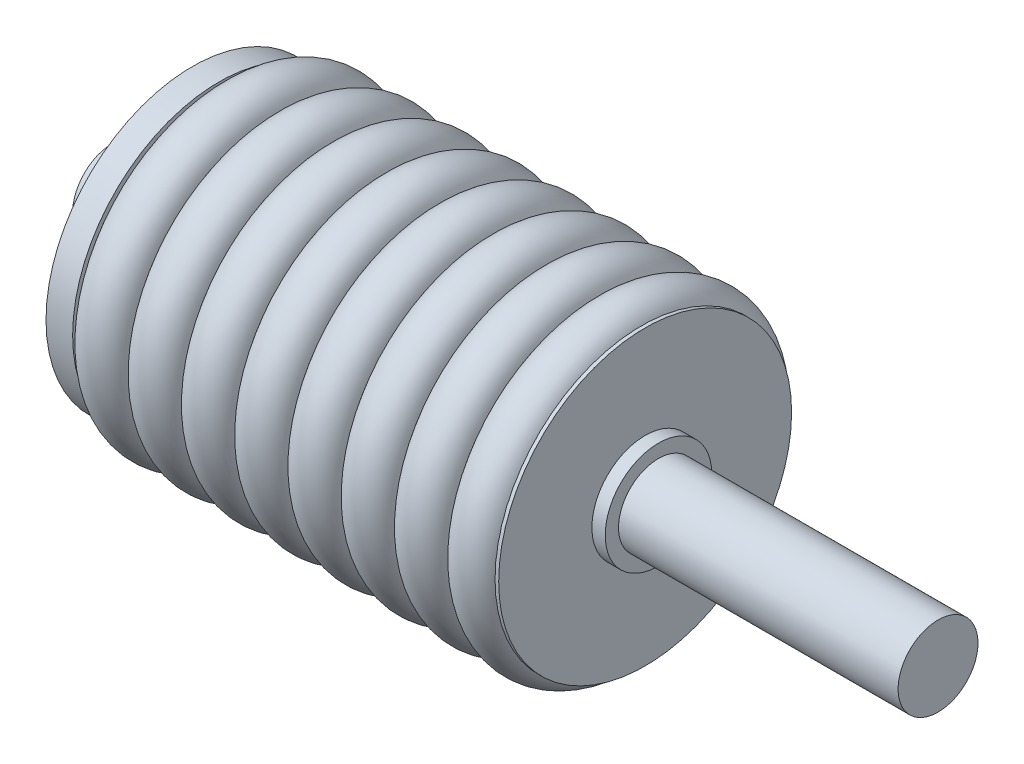
ISO-10303-21;
HEADER;
FILE_DESCRIPTION(('STEP AP214'),'2;1');
FILE_NAME('part.step','',(''),(''),'','','');
FILE_SCHEMA(('AUTOMOTIVE_DESIGN { 1 0 10303 214 1 1 1 1 }'));
ENDSEC;
DATA;
#1=APPLICATION_CONTEXT('core data for automotive mechanical design processes');
#2=APPLICATION_PROTOCOL_DEFINITION('international standard','automotive_design',2000,#1);
#3=PRODUCT_CONTEXT('',#1,'mechanical');
#4=PRODUCT('Part','Part','',(#3));
#5=PRODUCT_RELATED_PRODUCT_CATEGORY('part','',(#4));
#6=PRODUCT_DEFINITION_FORMATION('','',#4);
#7=PRODUCT_DEFINITION_CONTEXT('part definition',#1,'design');
#8=PRODUCT_DEFINITION('design','',#6,#7);
#9=PRODUCT_DEFINITION_SHAPE('','',#8);
#10=(LENGTH_UNIT() NAMED_UNIT(*) SI_UNIT(.MILLI.,.METRE.));
#11=(NAMED_UNIT(*) PLANE_ANGLE_UNIT() SI_UNIT($,.RADIAN.));
#12=(NAMED_UNIT(*) SI_UNIT($,.STERADIAN.) SOLID_ANGLE_UNIT());
#13=UNCERTAINTY_MEASURE_WITH_UNIT(LENGTH_MEASURE(1.E-05),#10,'distance_accuracy_value','');
#14=(GEOMETRIC_REPRESENTATION_CONTEXT(3) GLOBAL_UNCERTAINTY_ASSIGNED_CONTEXT((#13)) GLOBAL_UNIT_ASSIGNED_CONTEXT((#10,
#11,#12)) REPRESENTATION_CONTEXT('',''));
#15=CARTESIAN_POINT('',(0.,0.,0.));
#16=DIRECTION('',(0.,0.,1.));
#17=DIRECTION('',(1.,0.,0.));
#18=AXIS2_PLACEMENT_3D('',#15,#16,#17);
#19=CARTESIAN_POINT('',(32.,0.,0.));
#20=DIRECTION('',(-1.,0.,0.));
#21=DIRECTION('',(0.,0.,-1.));
#22=AXIS2_PLACEMENT_3D('',#19,#20,#21);
#23=TOROIDAL_SURFACE('',#22,9.99999999999999,2.);
#24=CARTESIAN_POINT('',(32.,0.,-12.));
#25=VERTEX_POINT('',#24);
#26=VERTEX_LOOP('',#25);
#27=FACE_BOUND('',#26,.T.);
#28=ADVANCED_FACE('F42',(#27),#23,.T.);
#29=CLOSED_SHELL('',(#28));
#30=MANIFOLD_SOLID_BREP('B2',#29);
#31=CARTESIAN_POINT('',(28.,0.,0.));
#32=DIRECTION('',(-1.,0.,0.));
#33=DIRECTION('',(0.,0.,-1.));
#34=AXIS2_PLACEMENT_3D('',#31,#32,#33);
#35=TOROIDAL_SURFACE('',#34,9.99999999999999,2.);
#36=CARTESIAN_POINT('',(28.,0.,-12.));
#37=VERTEX_POINT('',#36);
#38=VERTEX_LOOP('',#37);
#39=FACE_BOUND('',#38,.T.);
#40=ADVANCED_FACE('F63',(#39),#35,.T.);
#41=CLOSED_SHELL('',(#40));
#42=MANIFOLD_SOLID_BREP('B6',#41);
#43=CARTESIAN_POINT('',(24.,0.,0.));
#44=DIRECTION('',(-1.,0.,0.));
#45=DIRECTION('',(0.,0.,-1.));
#46=AXIS2_PLACEMENT_3D('',#43,#44,#45);
#47=TOROIDAL_SURFACE('',#46,9.99999999999999,2.);
#48=CARTESIAN_POINT('',(24.,0.,-12.));
#49=VERTEX_POINT('',#48);
#50=VERTEX_LOOP('',#49);
#51=FACE_BOUND('',#50,.T.);
#52=ADVANCED_FACE('F84',(#51),#47,.T.);
#53=CLOSED_SHELL('',(#52));
#54=MANIFOLD_SOLID_BREP('B38',#53);
#55=CARTESIAN_POINT('',(20.,0.,0.));
#56=DIRECTION('',(-1.,0.,0.));
#57=DIRECTION('',(0.,0.,-1.));
#58=AXIS2_PLACEMENT_3D('',#55,#56,#57);
#59=TOROIDAL_SURFACE('',#58,9.99999999999999,2.);
#60=CARTESIAN_POINT('',(20.,0.,-12.));
#61=VERTEX_POINT('',#60);
#62=VERTEX_LOOP('',#61);
#63=FACE_BOUND('',#62,.T.);
#64=ADVANCED_FACE('F105',(#63),#59,.T.);
#65=CLOSED_SHELL('',(#64));
#66=MANIFOLD_SOLID_BREP('B59',#65);
#67=CARTESIAN_POINT('',(16.,0.,0.));
#68=DIRECTION('',(-1.,0.,0.));
#69=DIRECTION('',(0.,0.,-1.));
#70=AXIS2_PLACEMENT_3D('',#67,#68,#69);
#71=TOROIDAL_SURFACE('',#70,9.99999999999999,2.);
#72=CARTESIAN_POINT('',(16.,0.,-12.));
#73=VERTEX_POINT('',#72);
#74=VERTEX_LOOP('',#73);
#75=FACE_BOUND('',#74,.T.);
#76=ADVANCED_FACE('F126',(#75),#71,.T.);
#77=CLOSED_SHELL('',(#76));
#78=MANIFOLD_SOLID_BREP('B80',#77);
#79=CARTESIAN_POINT('',(12.,0.,0.));
#80=DIRECTION('',(-1.,0.,0.));
#81=DIRECTION('',(0.,0.,-1.));
#82=AXIS2_PLACEMENT_3D('',#79,#80,#81);
#83=TOROIDAL_SURFACE('',#82,9.99999999999999,2.);
#84=CARTESIAN_POINT('',(12.,0.,-12.));
#85=VERTEX_POINT('',#84);
#86=VERTEX_LOOP('',#85);
#87=FACE_BOUND('',#86,.T.);
#88=ADVANCED_FACE('F147',(#87),#83,.T.);
#89=CLOSED_SHELL('',(#88));
#90=MANIFOLD_SOLID_BREP('B101',#89);
#91=CARTESIAN_POINT('',(8.,0.,0.));
#92=DIRECTION('',(-1.,0.,0.));
#93=DIRECTION('',(0.,0.,-1.));
#94=AXIS2_PLACEMENT_3D('',#91,#92,#93);
#95=TOROIDAL_SURFACE('',#94,9.99999999999999,2.);
#96=CARTESIAN_POINT('',(8.,0.,-12.));
#97=VERTEX_POINT('',#96);
#98=VERTEX_LOOP('',#97);
#99=FACE_BOUND('',#98,.T.);
#100=ADVANCED_FACE('F168',(#99),#95,.T.);
#101=CLOSED_SHELL('',(#100));
#102=MANIFOLD_SOLID_BREP('B122',#101);
#103=CARTESIAN_POINT('',(4.,0.,0.));
#104=DIRECTION('',(-1.,0.,0.));
#105=DIRECTION('',(0.,0.,-1.));
#106=AXIS2_PLACEMENT_3D('',#103,#104,#105);
#107=TOROIDAL_SURFACE('',#106,9.99999999999999,2.);
#108=CARTESIAN_POINT('',(4.,0.,-12.));
#109=VERTEX_POINT('',#108);
#110=VERTEX_LOOP('',#109);
#111=FACE_BOUND('',#110,.T.);
#112=ADVANCED_FACE('F190',(#111),#107,.T.);
#113=CLOSED_SHELL('',(#112));
#114=MANIFOLD_SOLID_BREP('B143',#113);
#115=CARTESIAN_POINT('',(-1.,3.,0.));
#116=DIRECTION('',(1.,0.,0.));
#117=DIRECTION('',(0.,0.,1.));
#118=AXIS2_PLACEMENT_3D('',#115,#116,#117);
#119=PLANE('',#118);
#120=CARTESIAN_POINT('',(-1.,0.,0.));
#121=DIRECTION('',(1.,0.,0.));
#122=DIRECTION('',(0.,0.,-1.));
#123=AXIS2_PLACEMENT_3D('',#120,#121,#122);
#124=CIRCLE('',#123,3.);
#125=CARTESIAN_POINT('',(-1.,0.,-3.));
#126=VERTEX_POINT('',#125);
#127=EDGE_CURVE('E249',#126,#126,#124,.T.);
#128=ORIENTED_EDGE('',*,*,#127,.T.);
#129=EDGE_LOOP('',(#128));
#130=FACE_BOUND('',#129,.T.);
#131=CARTESIAN_POINT('',(-1.,0.,0.));
#132=DIRECTION('',(1.,0.,0.));
#133=DIRECTION('',(0.,0.,-1.));
#134=AXIS2_PLACEMENT_3D('',#131,#132,#133);
#135=CIRCLE('',#134,4.);
#136=CARTESIAN_POINT('',(-1.,0.,-4.));
#137=VERTEX_POINT('',#136);
#138=EDGE_CURVE('E189',#137,#137,#135,.T.);
#139=ORIENTED_EDGE('',*,*,#138,.F.);
#140=EDGE_LOOP('',(#139));
#141=FACE_BOUND('',#140,.T.);
#142=ADVANCED_FACE('F203',(#130,#141),#119,.F.);
#143=CARTESIAN_POINT('',(-6.,0.,0.));
#144=DIRECTION('',(-1.,0.,0.));
#145=DIRECTION('',(0.,0.,-1.));
#146=AXIS2_PLACEMENT_3D('',#143,#144,#145);
#147=CYLINDRICAL_SURFACE('',#146,4.);
#148=ORIENTED_EDGE('',*,*,#138,.T.);
#149=EDGE_LOOP('',(#148));
#150=FACE_BOUND('',#149,.T.);
#151=CARTESIAN_POINT('',(0.,0.,0.));
#152=DIRECTION('',(1.,0.,0.));
#153=DIRECTION('',(0.,0.,-1.));
#154=AXIS2_PLACEMENT_3D('',#151,#152,#153);
#155=CIRCLE('',#154,4.);
#156=CARTESIAN_POINT('',(0.,0.,-4.));
#157=VERTEX_POINT('',#156);
#158=EDGE_CURVE('E209',#157,#157,#155,.T.);
#159=ORIENTED_EDGE('',*,*,#158,.F.);
#160=EDGE_LOOP('',(#159));
#161=FACE_BOUND('',#160,.T.);
#162=ADVANCED_FACE('F267',(#150,#161),#147,.T.);
#163=CARTESIAN_POINT('',(0.,4.00000000000001,0.));
#164=DIRECTION('',(1.,0.,0.));
#165=DIRECTION('',(0.,0.,1.));
#166=AXIS2_PLACEMENT_3D('',#163,#164,#165);
#167=PLANE('',#166);
#168=ORIENTED_EDGE('',*,*,#158,.T.);
#169=EDGE_LOOP('',(#168));
#170=FACE_BOUND('',#169,.T.);
#171=CARTESIAN_POINT('',(0.,0.,0.));
#172=DIRECTION('',(1.,0.,0.));
#173=DIRECTION('',(0.,0.,-1.));
#174=AXIS2_PLACEMENT_3D('',#171,#172,#173);
#175=CIRCLE('',#174,11.);
#176=CARTESIAN_POINT('',(0.,0.,-11.));
#177=VERTEX_POINT('',#176);
#178=EDGE_CURVE('E213',#177,#177,#175,.T.);
#179=ORIENTED_EDGE('',*,*,#178,.F.);
#180=EDGE_LOOP('',(#179));
#181=FACE_BOUND('',#180,.T.);
#182=ADVANCED_FACE('F271',(#170,#181),#167,.F.);
#183=CARTESIAN_POINT('',(-6.,0.,0.));
#184=DIRECTION('',(-1.,0.,0.));
#185=DIRECTION('',(0.,0.,-1.));
#186=AXIS2_PLACEMENT_3D('',#183,#184,#185);
#187=CYLINDRICAL_SURFACE('',#186,11.);
#188=ORIENTED_EDGE('',*,*,#178,.T.);
#189=EDGE_LOOP('',(#188));
#190=FACE_BOUND('',#189,.T.);
#191=CARTESIAN_POINT('',(2.,0.,0.));
#192=DIRECTION('',(1.,0.,0.));
#193=DIRECTION('',(0.,0.,-1.));
#194=AXIS2_PLACEMENT_3D('',#191,#192,#193);
#195=CIRCLE('',#194,11.);
#196=CARTESIAN_POINT('',(2.,0.,-11.));
#197=VERTEX_POINT('',#196);
#198=EDGE_CURVE('E217',#197,#197,#195,.T.);
#199=ORIENTED_EDGE('',*,*,#198,.F.);
#200=EDGE_LOOP('',(#199));
#201=FACE_BOUND('',#200,.T.);
#202=ADVANCED_FACE('F275',(#190,#201),#187,.T.);
#203=CARTESIAN_POINT('',(2.,11.,0.));
#204=DIRECTION('',(-1.,0.,0.));
#205=DIRECTION('',(0.,0.,-1.));
#206=AXIS2_PLACEMENT_3D('',#203,#204,#205);
#207=PLANE('',#206);
#208=ORIENTED_EDGE('',*,*,#198,.T.);
#209=EDGE_LOOP('',(#208));
#210=FACE_BOUND('',#209,.T.);
#211=CARTESIAN_POINT('',(2.,0.,0.));
#212=DIRECTION('',(1.,0.,0.));
#213=DIRECTION('',(0.,0.,-1.));
#214=AXIS2_PLACEMENT_3D('',#211,#212,#213);
#215=CIRCLE('',#214,8.);
#216=CARTESIAN_POINT('',(2.,0.,-8.));
#217=VERTEX_POINT('',#216);
#218=EDGE_CURVE('E222',#217,#217,#215,.T.);
#219=ORIENTED_EDGE('',*,*,#218,.F.);
#220=EDGE_LOOP('',(#219));
#221=FACE_BOUND('',#220,.T.);
#222=ADVANCED_FACE('F281',(#210,#221),#207,.F.);
#223=CARTESIAN_POINT('',(-6.,0.,0.));
#224=DIRECTION('',(-1.,0.,0.));
#225=DIRECTION('',(0.,0.,-1.));
#226=AXIS2_PLACEMENT_3D('',#223,#224,#225);
#227=CYLINDRICAL_SURFACE('',#226,8.);
#228=ORIENTED_EDGE('',*,*,#218,.T.);
#229=EDGE_LOOP('',(#228));
#230=FACE_BOUND('',#229,.T.);
#231=CARTESIAN_POINT('',(32.,0.,0.));
#232=DIRECTION('',(1.,0.,0.));
#233=DIRECTION('',(0.,0.,-1.));
#234=AXIS2_PLACEMENT_3D('',#231,#232,#233);
#235=CIRCLE('',#234,8.);
#236=CARTESIAN_POINT('',(32.,0.,-8.));
#237=VERTEX_POINT('',#236);
#238=EDGE_CURVE('E225',#237,#237,#235,.T.);
#239=ORIENTED_EDGE('',*,*,#238,.F.);
#240=EDGE_LOOP('',(#239));
#241=FACE_BOUND('',#240,.T.);
#242=ADVANCED_FACE('F285',(#230,#241),#227,.T.);
#243=CARTESIAN_POINT('',(32.,11.,0.));
#244=DIRECTION('',(1.,0.,0.));
#245=DIRECTION('',(0.,0.,1.));
#246=AXIS2_PLACEMENT_3D('',#243,#244,#245);
#247=PLANE('',#246);
#248=ORIENTED_EDGE('',*,*,#238,.T.);
#249=EDGE_LOOP('',(#248));
#250=FACE_BOUND('',#249,.T.);
#251=CARTESIAN_POINT('',(32.,0.,0.));
#252=DIRECTION('',(1.,0.,0.));
#253=DIRECTION('',(0.,0.,-1.));
#254=AXIS2_PLACEMENT_3D('',#251,#252,#253);
#255=CIRCLE('',#254,11.);
#256=CARTESIAN_POINT('',(32.,0.,-11.));
#257=VERTEX_POINT('',#256);
#258=EDGE_CURVE('E228',#257,#257,#255,.T.);
#259=ORIENTED_EDGE('',*,*,#258,.F.);
#260=EDGE_LOOP('',(#259));
#261=FACE_BOUND('',#260,.T.);
#262=ADVANCED_FACE('F289',(#250,#261),#247,.F.);
#263=CARTESIAN_POINT('',(-6.,0.,0.));
#264=DIRECTION('',(-1.,0.,0.));
#265=DIRECTION('',(0.,0.,-1.));
#266=AXIS2_PLACEMENT_3D('',#263,#264,#265);
#267=CYLINDRICAL_SURFACE('',#266,11.);
#268=ORIENTED_EDGE('',*,*,#258,.T.);
#269=EDGE_LOOP('',(#268));
#270=FACE_BOUND('',#269,.T.);
#271=CARTESIAN_POINT('',(34.,0.,0.));
#272=DIRECTION('',(1.,0.,0.));
#273=DIRECTION('',(0.,0.,-1.));
#274=AXIS2_PLACEMENT_3D('',#271,#272,#273);
#275=CIRCLE('',#274,11.);
#276=CARTESIAN_POINT('',(34.,0.,-11.));
#277=VERTEX_POINT('',#276);
#278=EDGE_CURVE('E231',#277,#277,#275,.T.);
#279=ORIENTED_EDGE('',*,*,#278,.F.);
#280=EDGE_LOOP('',(#279));
#281=FACE_BOUND('',#280,.T.);
#282=ADVANCED_FACE('F293',(#270,#281),#267,.T.);
#283=CARTESIAN_POINT('',(34.,4.00000000000001,0.));
#284=DIRECTION('',(-1.,0.,0.));
#285=DIRECTION('',(0.,0.,-1.));
#286=AXIS2_PLACEMENT_3D('',#283,#284,#285);
#287=PLANE('',#286);
#288=ORIENTED_EDGE('',*,*,#278,.T.);
#289=EDGE_LOOP('',(#288));
#290=FACE_BOUND('',#289,.T.);
#291=CARTESIAN_POINT('',(34.,0.,0.));
#292=DIRECTION('',(1.,0.,0.));
#293=DIRECTION('',(0.,0.,-1.));
#294=AXIS2_PLACEMENT_3D('',#291,#292,#293);
#295=CIRCLE('',#294,4.);
#296=CARTESIAN_POINT('',(34.,0.,-4.));
#297=VERTEX_POINT('',#296);
#298=EDGE_CURVE('E234',#297,#297,#295,.T.);
#299=ORIENTED_EDGE('',*,*,#298,.F.);
#300=EDGE_LOOP('',(#299));
#301=FACE_BOUND('',#300,.T.);
#302=ADVANCED_FACE('F297',(#290,#301),#287,.F.);
#303=CARTESIAN_POINT('',(-6.,0.,0.));
#304=DIRECTION('',(-1.,0.,0.));
#305=DIRECTION('',(0.,0.,-1.));
#306=AXIS2_PLACEMENT_3D('',#303,#304,#305);
#307=CYLINDRICAL_SURFACE('',#306,4.);
#308=ORIENTED_EDGE('',*,*,#298,.T.);
#309=EDGE_LOOP('',(#308));
#310=FACE_BOUND('',#309,.T.);
#311=CARTESIAN_POINT('',(35.,0.,0.));
#312=DIRECTION('',(1.,0.,0.));
#313=DIRECTION('',(0.,0.,-1.));
#314=AXIS2_PLACEMENT_3D('',#311,#312,#313);
#315=CIRCLE('',#314,4.);
#316=CARTESIAN_POINT('',(35.,0.,-4.));
#317=VERTEX_POINT('',#316);
#318=EDGE_CURVE('E237',#317,#317,#315,.T.);
#319=ORIENTED_EDGE('',*,*,#318,.F.);
#320=EDGE_LOOP('',(#319));
#321=FACE_BOUND('',#320,.T.);
#322=ADVANCED_FACE('F301',(#310,#321),#307,.T.);
#323=CARTESIAN_POINT('',(35.,4.00000000000001,0.));
#324=DIRECTION('',(-1.,0.,0.));
#325=DIRECTION('',(0.,0.,-1.));
#326=AXIS2_PLACEMENT_3D('',#323,#324,#325);
#327=PLANE('',#326);
#328=ORIENTED_EDGE('',*,*,#318,.T.);
#329=EDGE_LOOP('',(#328));
#330=FACE_BOUND('',#329,.T.);
#331=CARTESIAN_POINT('',(35.,0.,0.));
#332=DIRECTION('',(1.,0.,0.));
#333=DIRECTION('',(0.,0.,-1.));
#334=AXIS2_PLACEMENT_3D('',#331,#332,#333);
#335=CIRCLE('',#334,3.);
#336=CARTESIAN_POINT('',(35.,0.,-3.));
#337=VERTEX_POINT('',#336);
#338=EDGE_CURVE('E240',#337,#337,#335,.T.);
#339=ORIENTED_EDGE('',*,*,#338,.F.);
#340=EDGE_LOOP('',(#339));
#341=FACE_BOUND('',#340,.T.);
#342=ADVANCED_FACE('F305',(#330,#341),#327,.F.);
#343=CARTESIAN_POINT('',(-6.,0.,0.));
#344=DIRECTION('',(-1.,0.,0.));
#345=DIRECTION('',(0.,0.,-1.));
#346=AXIS2_PLACEMENT_3D('',#343,#344,#345);
#347=CYLINDRICAL_SURFACE('',#346,3.);
#348=ORIENTED_EDGE('',*,*,#338,.T.);
#349=EDGE_LOOP('',(#348));
#350=FACE_BOUND('',#349,.T.);
#351=CARTESIAN_POINT('',(56.,0.,0.));
#352=DIRECTION('',(1.,0.,0.));
#353=DIRECTION('',(0.,0.,-1.));
#354=AXIS2_PLACEMENT_3D('',#351,#352,#353);
#355=CIRCLE('',#354,3.);
#356=CARTESIAN_POINT('',(56.,0.,-3.));
#357=VERTEX_POINT('',#356);
#358=EDGE_CURVE('E243',#357,#357,#355,.T.);
#359=ORIENTED_EDGE('',*,*,#358,.F.);
#360=EDGE_LOOP('',(#359));
#361=FACE_BOUND('',#360,.T.);
#362=ADVANCED_FACE('F309',(#350,#361),#347,.T.);
#363=CARTESIAN_POINT('',(56.,3.,0.));
#364=DIRECTION('',(-1.,0.,0.));
#365=DIRECTION('',(0.,0.,-1.));
#366=AXIS2_PLACEMENT_3D('',#363,#364,#365);
#367=PLANE('',#366);
#368=ORIENTED_EDGE('',*,*,#358,.T.);
#369=EDGE_LOOP('',(#368));
#370=FACE_BOUND('',#369,.T.);
#371=ADVANCED_FACE('F263',(#370),#367,.F.);
#372=CARTESIAN_POINT('',(-6.,3.,0.));
#373=DIRECTION('',(1.,0.,0.));
#374=DIRECTION('',(0.,0.,1.));
#375=AXIS2_PLACEMENT_3D('',#372,#373,#374);
#376=PLANE('',#375);
#377=CARTESIAN_POINT('',(-6.,0.,0.));
#378=DIRECTION('',(1.,0.,0.));
#379=DIRECTION('',(0.,0.,-1.));
#380=AXIS2_PLACEMENT_3D('',#377,#378,#379);
#381=CIRCLE('',#380,3.);
#382=CARTESIAN_POINT('',(-6.,0.,-3.));
#383=VERTEX_POINT('',#382);
#384=EDGE_CURVE('E246',#383,#383,#381,.T.);
#385=ORIENTED_EDGE('',*,*,#384,.F.);
#386=EDGE_LOOP('',(#385));
#387=FACE_BOUND('',#386,.T.);
#388=ADVANCED_FACE('F257',(#387),#376,.F.);
#389=CARTESIAN_POINT('',(-6.,0.,0.));
#390=DIRECTION('',(-1.,0.,0.));
#391=DIRECTION('',(0.,0.,-1.));
#392=AXIS2_PLACEMENT_3D('',#389,#390,#391);
#393=CYLINDRICAL_SURFACE('',#392,3.);
#394=ORIENTED_EDGE('',*,*,#384,.T.);
#395=EDGE_LOOP('',(#394));
#396=FACE_BOUND('',#395,.T.);
#397=ORIENTED_EDGE('',*,*,#127,.F.);
#398=EDGE_LOOP('',(#397));
#399=FACE_BOUND('',#398,.T.);
#400=ADVANCED_FACE('F255',(#396,#399),#393,.T.);
#401=CLOSED_SHELL('',(#142,#162,#182,#202,#222,#242,#262,#282,#302,#322,#342,#362,#371,#388,#400));
#402=MANIFOLD_SOLID_BREP('B164',#401);
#403=ADVANCED_BREP_SHAPE_REPRESENTATION('',(#18,#30,#42,#54,#66,#78,#90,#102,#114,#402),#14);
#404=SHAPE_DEFINITION_REPRESENTATION(#9,#403);
ENDSEC;
END-ISO-10303-21;
